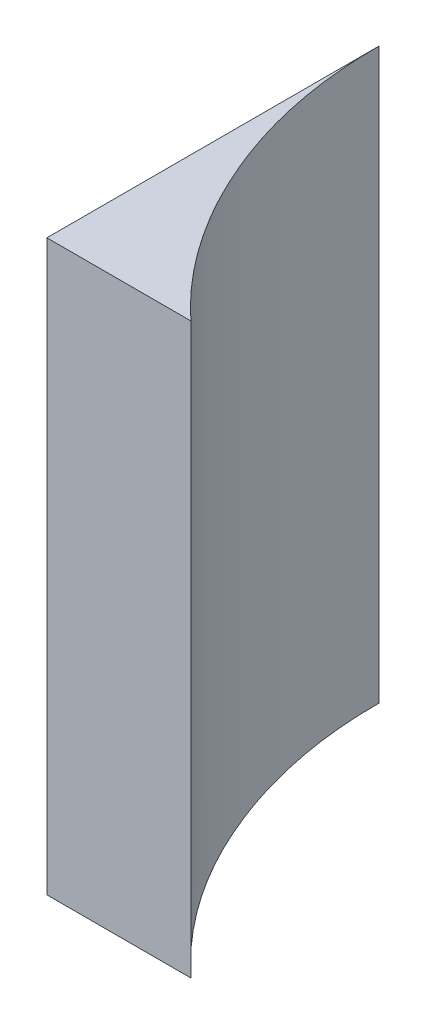
ISO-10303-21;
HEADER;
FILE_DESCRIPTION(('STEP AP214'),'2;1');
FILE_NAME('part.step','',(''),(''),'','','');
FILE_SCHEMA(('AUTOMOTIVE_DESIGN { 1 0 10303 214 1 1 1 1 }'));
ENDSEC;
DATA;
#1=APPLICATION_CONTEXT('core data for automotive mechanical design processes');
#2=APPLICATION_PROTOCOL_DEFINITION('international standard','automotive_design',2000,#1);
#3=PRODUCT_CONTEXT('',#1,'mechanical');
#4=PRODUCT('Part','Part','',(#3));
#5=PRODUCT_RELATED_PRODUCT_CATEGORY('part','',(#4));
#6=PRODUCT_DEFINITION_FORMATION('','',#4);
#7=PRODUCT_DEFINITION_CONTEXT('part definition',#1,'design');
#8=PRODUCT_DEFINITION('design','',#6,#7);
#9=PRODUCT_DEFINITION_SHAPE('','',#8);
#10=(LENGTH_UNIT() NAMED_UNIT(*) SI_UNIT(.MILLI.,.METRE.));
#11=(NAMED_UNIT(*) PLANE_ANGLE_UNIT() SI_UNIT($,.RADIAN.));
#12=(NAMED_UNIT(*) SI_UNIT($,.STERADIAN.) SOLID_ANGLE_UNIT());
#13=UNCERTAINTY_MEASURE_WITH_UNIT(LENGTH_MEASURE(1.E-05),#10,'distance_accuracy_value','');
#14=(GEOMETRIC_REPRESENTATION_CONTEXT(3) GLOBAL_UNCERTAINTY_ASSIGNED_CONTEXT((#13)) GLOBAL_UNIT_ASSIGNED_CONTEXT((#10,
#11,#12)) REPRESENTATION_CONTEXT('',''));
#15=CARTESIAN_POINT('',(0.,0.,0.));
#16=DIRECTION('',(0.,0.,1.));
#17=DIRECTION('',(1.,0.,0.));
#18=AXIS2_PLACEMENT_3D('',#15,#16,#17);
#19=CARTESIAN_POINT('',(-39.9886378183138,6.21428126558671,1.14491452249226));
#20=DIRECTION('',(0.,-1.,0.));
#21=DIRECTION('',(-1.,0.,0.));
#22=AXIS2_PLACEMENT_3D('',#19,#20,#21);
#23=PLANE('',#22);
#24=CARTESIAN_POINT('',(-39.6231700705933,6.21428126558673,5.15404756941707));
#25=CARTESIAN_POINT('',(-39.6231700705933,6.21428126558673,5.20269832405573));
#26=CARTESIAN_POINT('',(-39.6231700705933,6.21428126558673,5.25134907869439));
#27=CARTESIAN_POINT('',(-39.6231700705933,6.21428126558673,5.29999983333305));
#28=(BOUNDED_CURVE() B_SPLINE_CURVE(3,(#24,#25,#26,#27),.UNSPECIFIED.,.F.,
.F.) B_SPLINE_CURVE_WITH_KNOTS((4,4),(-0.999998963608096,-1.14192339871519E-06),
.UNSPECIFIED.) CURVE() GEOMETRIC_REPRESENTATION_ITEM() RATIONAL_B_SPLINE_CURVE((1.,1.,1.,1.)) REPRESENTATION_ITEM(''));
#29=CARTESIAN_POINT('',(-39.6231700707101,6.21428109892006,5.15404756941707));
#30=VERTEX_POINT('',#29);
#31=CARTESIAN_POINT('',(-39.6231699039266,6.21428109892005,5.29999983333305));
#32=VERTEX_POINT('',#31);
#33=EDGE_CURVE('E11',#30,#32,#28,.T.);
#34=ORIENTED_EDGE('',*,*,#33,.T.);
#35=CARTESIAN_POINT('',(-39.6231699039266,6.2142812655867,5.29999999999972));
#36=CARTESIAN_POINT('',(-39.6020834222309,6.2142812655867,5.29999999999972));
#37=CARTESIAN_POINT('',(-39.5809969405352,6.2142812655867,5.29999999999972));
#38=CARTESIAN_POINT('',(-39.5599104588394,6.2142812655867,5.29999999999972));
#39=(BOUNDED_CURVE() B_SPLINE_CURVE(3,(#35,#36,#37,#38),.UNSPECIFIED.,.F.,
.F.) B_SPLINE_CURVE_WITH_KNOTS((4,4),(-0.999997365367955,-5.19789356077743E-06),
.UNSPECIFIED.) CURVE() GEOMETRIC_REPRESENTATION_ITEM() RATIONAL_B_SPLINE_CURVE((1.,1.,1.,1.)) REPRESENTATION_ITEM(''));
#40=CARTESIAN_POINT('',(-39.5599104588394,6.21428109892005,5.29999988557667));
#41=VERTEX_POINT('',#40);
#42=EDGE_CURVE('E85',#32,#41,#39,.T.);
#43=ORIENTED_EDGE('',*,*,#42,.T.);
#44=CARTESIAN_POINT('',(-39.5599103637387,6.21428126558672,5.29999978310146));
#45=CARTESIAN_POINT('',(-39.5896037680761,6.21428126558672,5.27244321208635));
#46=CARTESIAN_POINT('',(-39.6066505450453,6.21428126558672,5.23357290825011));
#47=CARTESIAN_POINT('',(-39.6233659958951,6.21428126558672,5.19545809895422));
#48=CARTESIAN_POINT('',(-39.623170071309,6.21428126558672,5.15404756941424));
#49=B_SPLINE_CURVE_WITH_KNOTS('',2,(#44,#45,#46,#47,#48),.UNSPECIFIED.,.F.,.F.,(3,2,3),(0.,0.5,
1.),.UNSPECIFIED.);
#50=EDGE_CURVE('E82',#41,#30,#49,.T.);
#51=ORIENTED_EDGE('',*,*,#50,.T.);
#52=EDGE_LOOP('',(#34,#43,#51));
#53=FACE_BOUND('',#52,.T.);
#54=ADVANCED_FACE('F17',(#53),#23,.F.);
#55=CARTESIAN_POINT('',(-39.6231700705933,5.96328126558672,2.5049602616811));
#56=DIRECTION('',(1.,0.,0.));
#57=DIRECTION('',(0.,1.,0.));
#58=AXIS2_PLACEMENT_3D('',#55,#56,#57);
#59=PLANE('',#58);
#60=CARTESIAN_POINT('',(-39.6231700705933,5.96428126558672,5.15404756941707));
#61=CARTESIAN_POINT('',(-39.6231700705933,5.96428126558672,5.20269832405573));
#62=CARTESIAN_POINT('',(-39.6231700705933,5.96428126558673,5.25134907869439));
#63=CARTESIAN_POINT('',(-39.6231700705933,5.96428126558673,5.29999983333305));
#64=(BOUNDED_CURVE() B_SPLINE_CURVE(3,(#60,#61,#62,#63),.UNSPECIFIED.,.F.,
.F.) B_SPLINE_CURVE_WITH_KNOTS((4,4),(-0.999998963608476,-1.14192339277286E-06),
.UNSPECIFIED.) CURVE() GEOMETRIC_REPRESENTATION_ITEM() RATIONAL_B_SPLINE_CURVE((1.,1.,1.,1.)) REPRESENTATION_ITEM(''));
#65=CARTESIAN_POINT('',(-39.6231700707101,5.96428143225339,5.15404756941707));
#66=VERTEX_POINT('',#65);
#67=CARTESIAN_POINT('',(-39.6231699039266,5.96428143225339,5.29999983333305));
#68=VERTEX_POINT('',#67);
#69=EDGE_CURVE('E29',#66,#68,#64,.T.);
#70=ORIENTED_EDGE('',*,*,#69,.T.);
#71=CARTESIAN_POINT('',(-39.6231700705933,5.96428143225339,5.29999999999972));
#72=CARTESIAN_POINT('',(-39.6231700705933,6.04761465447561,5.29999999999972));
#73=CARTESIAN_POINT('',(-39.6231700705933,6.13094787669783,5.29999999999972));
#74=CARTESIAN_POINT('',(-39.6231700705933,6.21428109892005,5.29999999999972));
#75=(BOUNDED_CURVE() B_SPLINE_CURVE(3,(#71,#72,#73,#74),.UNSPECIFIED.,.F.,
.F.) B_SPLINE_CURVE_WITH_KNOTS((4,4),(-0.999999333333254,-6.66666589987929E-07),
.UNSPECIFIED.) CURVE() GEOMETRIC_REPRESENTATION_ITEM() RATIONAL_B_SPLINE_CURVE((1.,1.,1.,1.)) REPRESENTATION_ITEM(''));
#76=EDGE_CURVE('E72',#68,#32,#75,.T.);
#77=ORIENTED_EDGE('',*,*,#76,.T.);
#78=ORIENTED_EDGE('',*,*,#33,.F.);
#79=CARTESIAN_POINT('',(-39.6231700705933,6.21428109892006,5.154047418153));
#80=CARTESIAN_POINT('',(-39.6231700705933,6.13094787669784,5.154047418153));
#81=CARTESIAN_POINT('',(-39.6231700705933,6.04761465447562,5.154047418153));
#82=CARTESIAN_POINT('',(-39.6231700705933,5.9642814322534,5.154047418153));
#83=(BOUNDED_CURVE() B_SPLINE_CURVE(3,(#79,#80,#81,#82),.UNSPECIFIED.,.F.,
.F.) B_SPLINE_CURVE_WITH_KNOTS((4,4),(6.66666676724111E-07,0.999999333333351),
.UNSPECIFIED.) CURVE() GEOMETRIC_REPRESENTATION_ITEM() RATIONAL_B_SPLINE_CURVE((1.,1.,1.,1.)) REPRESENTATION_ITEM(''));
#84=EDGE_CURVE('E90',#30,#66,#83,.T.);
#85=ORIENTED_EDGE('',*,*,#84,.T.);
#86=EDGE_LOOP('',(#70,#77,#78,#85));
#87=FACE_BOUND('',#86,.T.);
#88=ADVANCED_FACE('F110',(#87),#59,.F.);
#89=CARTESIAN_POINT('',(-37.261250671403,5.96428126558671,1.14491452249215));
#90=DIRECTION('',(0.,1.,0.));
#91=DIRECTION('',(0.,0.,-1.));
#92=AXIS2_PLACEMENT_3D('',#89,#90,#91);
#93=PLANE('',#92);
#94=CARTESIAN_POINT('',(-39.5599104588394,5.9642812655867,5.29999999999972));
#95=CARTESIAN_POINT('',(-39.580996940534,5.9642812655867,5.29999999999972));
#96=CARTESIAN_POINT('',(-39.6020834222286,5.9642812655867,5.29999999999972));
#97=CARTESIAN_POINT('',(-39.6231699039232,5.9642812655867,5.29999999999972));
#98=(BOUNDED_CURVE() B_SPLINE_CURVE(3,(#94,#95,#96,#97),.UNSPECIFIED.,.F.,
.F.) B_SPLINE_CURVE_WITH_KNOTS((4,4),(-0.999994802106659,-2.63468688901814E-06),
.UNSPECIFIED.) CURVE() GEOMETRIC_REPRESENTATION_ITEM() RATIONAL_B_SPLINE_CURVE((1.,1.,1.,1.)) REPRESENTATION_ITEM(''));
#99=CARTESIAN_POINT('',(-39.5599104588394,5.96428143225339,5.29999988557667));
#100=VERTEX_POINT('',#99);
#101=EDGE_CURVE('E66',#100,#68,#98,.T.);
#102=ORIENTED_EDGE('',*,*,#101,.T.);
#103=ORIENTED_EDGE('',*,*,#69,.F.);
#104=CARTESIAN_POINT('',(-39.623170071309,5.96428126558672,5.15404756941424));
#105=CARTESIAN_POINT('',(-39.6233617332523,5.96428126558672,5.19455714874873));
#106=CARTESIAN_POINT('',(-39.6066505450453,5.96428126558672,5.23357290825011));
#107=CARTESIAN_POINT('',(-39.5902641620094,5.96428126558672,5.27183034223446));
#108=CARTESIAN_POINT('',(-39.5599103637387,5.96428126558672,5.29999978310147));
#109=B_SPLINE_CURVE_WITH_KNOTS('',2,(#104,#105,#106,#107,#108),.UNSPECIFIED.,.F.,.F.,(3,2,3),
(0.,0.5,1.),.UNSPECIFIED.);
#110=EDGE_CURVE('E80',#66,#100,#109,.T.);
#111=ORIENTED_EDGE('',*,*,#110,.T.);
#112=EDGE_LOOP('',(#102,#103,#111));
#113=FACE_BOUND('',#112,.T.);
#114=ADVANCED_FACE('F88',(#113),#93,.F.);
#115=CARTESIAN_POINT('',(-41.1820410614753,11.0902812655867,5.2999999999997));
#116=DIRECTION('',(0.,0.,-1.));
#117=DIRECTION('',(0.,-1.,0.));
#118=AXIS2_PLACEMENT_3D('',#115,#116,#117);
#119=PLANE('',#118);
#120=CARTESIAN_POINT('',(-39.559910130021,5.96428143225339,5.29999999999972));
#121=CARTESIAN_POINT('',(-39.559910130021,6.04761465447561,5.29999999999972));
#122=CARTESIAN_POINT('',(-39.559910130021,6.13094787669783,5.29999999999972));
#123=CARTESIAN_POINT('',(-39.559910130021,6.21428109892005,5.29999999999972));
#124=(BOUNDED_CURVE() B_SPLINE_CURVE(3,(#120,#121,#122,#123),.UNSPECIFIED.,.F.,
.F.) B_SPLINE_CURVE_WITH_KNOTS((4,4),(6.66666746113042E-07,0.99999933333341),
.UNSPECIFIED.) CURVE() GEOMETRIC_REPRESENTATION_ITEM() RATIONAL_B_SPLINE_CURVE((1.,1.,1.,1.)) REPRESENTATION_ITEM(''));
#125=EDGE_CURVE('E70',#100,#41,#124,.T.);
#126=ORIENTED_EDGE('',*,*,#125,.T.);
#127=ORIENTED_EDGE('',*,*,#42,.F.);
#128=ORIENTED_EDGE('',*,*,#76,.F.);
#129=ORIENTED_EDGE('',*,*,#101,.F.);
#130=EDGE_LOOP('',(#126,#127,#128,#129));
#131=FACE_BOUND('',#130,.T.);
#132=ADVANCED_FACE('F68',(#131),#119,.F.);
#133=CARTESIAN_POINT('',(-39.4231700705933,6.21428126558673,5.154047418153));
#134=DIRECTION('',(0.,-1.,0.));
#135=DIRECTION('',(0.917523922614113,0.,-0.397680589708387));
#136=AXIS2_PLACEMENT_3D('',#133,#134,#135);
#137=CYLINDRICAL_SURFACE('',#136,0.2);
#138=ORIENTED_EDGE('',*,*,#110,.F.);
#139=ORIENTED_EDGE('',*,*,#84,.F.);
#140=ORIENTED_EDGE('',*,*,#50,.F.);
#141=ORIENTED_EDGE('',*,*,#125,.F.);
#142=EDGE_LOOP('',(#138,#139,#140,#141));
#143=FACE_BOUND('',#142,.T.);
#144=ADVANCED_FACE('F78',(#143),#137,.F.);
#145=CLOSED_SHELL('',(#54,#88,#114,#132,#144));
#146=MANIFOLD_SOLID_BREP('B1',#145);
#147=ADVANCED_BREP_SHAPE_REPRESENTATION('',(#18,#146),#14);
#148=SHAPE_DEFINITION_REPRESENTATION(#9,#147);
ENDSEC;
END-ISO-10303-21;
